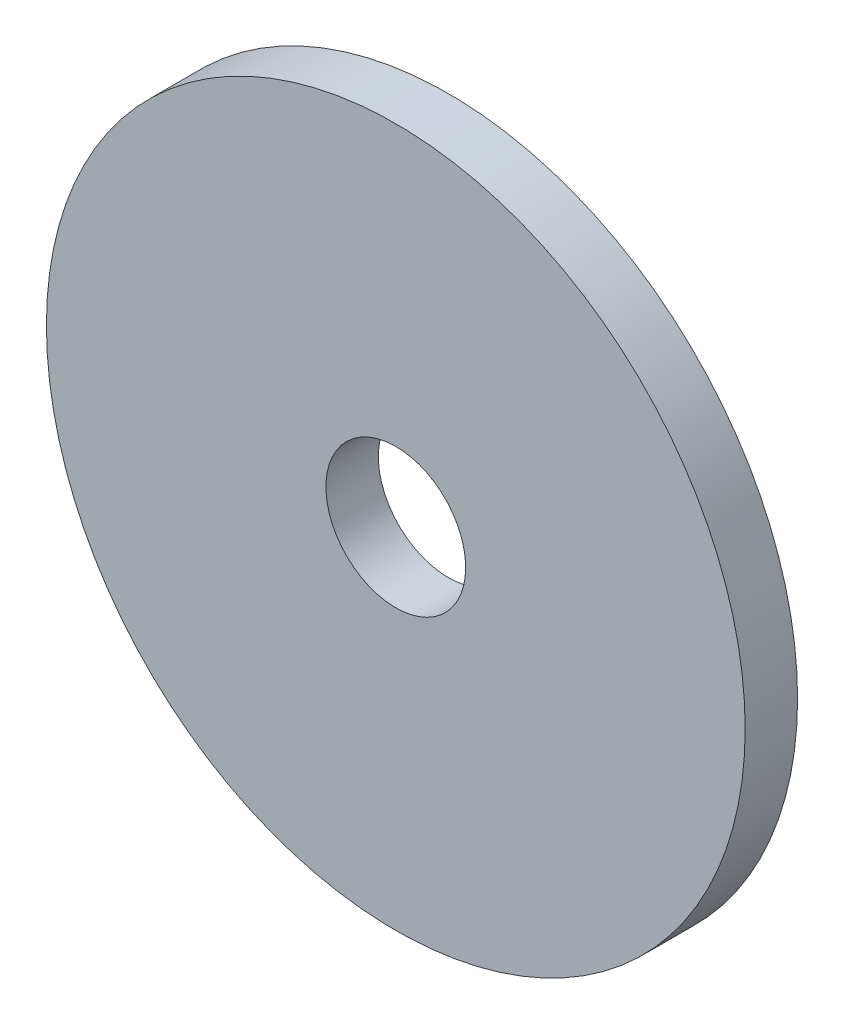
ISO-10303-21;
HEADER;
FILE_DESCRIPTION(('STEP AP214'),'2;1');
FILE_NAME('part.step','',(''),(''),'','','');
FILE_SCHEMA(('AUTOMOTIVE_DESIGN { 1 0 10303 214 1 1 1 1 }'));
ENDSEC;
DATA;
#1=APPLICATION_CONTEXT('core data for automotive mechanical design processes');
#2=APPLICATION_PROTOCOL_DEFINITION('international standard','automotive_design',2000,#1);
#3=PRODUCT_CONTEXT('',#1,'mechanical');
#4=PRODUCT('Part','Part','',(#3));
#5=PRODUCT_RELATED_PRODUCT_CATEGORY('part','',(#4));
#6=PRODUCT_DEFINITION_FORMATION('','',#4);
#7=PRODUCT_DEFINITION_CONTEXT('part definition',#1,'design');
#8=PRODUCT_DEFINITION('design','',#6,#7);
#9=PRODUCT_DEFINITION_SHAPE('','',#8);
#10=(LENGTH_UNIT() NAMED_UNIT(*) SI_UNIT(.MILLI.,.METRE.));
#11=(NAMED_UNIT(*) PLANE_ANGLE_UNIT() SI_UNIT($,.RADIAN.));
#12=(NAMED_UNIT(*) SI_UNIT($,.STERADIAN.) SOLID_ANGLE_UNIT());
#13=UNCERTAINTY_MEASURE_WITH_UNIT(LENGTH_MEASURE(1.E-05),#10,'distance_accuracy_value','');
#14=(GEOMETRIC_REPRESENTATION_CONTEXT(3) GLOBAL_UNCERTAINTY_ASSIGNED_CONTEXT((#13)) GLOBAL_UNIT_ASSIGNED_CONTEXT((#10,
#11,#12)) REPRESENTATION_CONTEXT('',''));
#15=CARTESIAN_POINT('',(0.,0.,0.));
#16=DIRECTION('',(0.,0.,1.));
#17=DIRECTION('',(1.,0.,0.));
#18=AXIS2_PLACEMENT_3D('',#15,#16,#17);
#19=CARTESIAN_POINT('',(-38.1,0.,1.905));
#20=DIRECTION('',(0.,0.,-1.));
#21=DIRECTION('',(-1.,0.,0.));
#22=AXIS2_PLACEMENT_3D('',#19,#20,#21);
#23=CYLINDRICAL_SURFACE('',#22,2.54);
#24=CARTESIAN_POINT('',(-38.1,0.,1.905));
#25=DIRECTION('',(0.,0.,1.));
#26=DIRECTION('',(1.,0.,0.));
#27=AXIS2_PLACEMENT_3D('',#24,#25,#26);
#28=CIRCLE('',#27,2.54);
#29=CARTESIAN_POINT('',(-35.56,0.,1.905));
#30=VERTEX_POINT('',#29);
#31=EDGE_CURVE('E22',#30,#30,#28,.T.);
#32=ORIENTED_EDGE('',*,*,#31,.T.);
#33=EDGE_LOOP('',(#32));
#34=FACE_BOUND('',#33,.T.);
#35=CARTESIAN_POINT('',(-38.1,0.,0.));
#36=DIRECTION('',(0.,0.,1.));
#37=DIRECTION('',(1.,0.,0.));
#38=AXIS2_PLACEMENT_3D('',#35,#36,#37);
#39=CIRCLE('',#38,2.54);
#40=CARTESIAN_POINT('',(-35.56,0.,0.));
#41=VERTEX_POINT('',#40);
#42=EDGE_CURVE('E28',#41,#41,#39,.T.);
#43=ORIENTED_EDGE('',*,*,#42,.F.);
#44=EDGE_LOOP('',(#43));
#45=FACE_BOUND('',#44,.T.);
#46=ADVANCED_FACE('F15',(#34,#45),#23,.F.);
#47=CARTESIAN_POINT('',(-38.1,0.,1.905));
#48=DIRECTION('',(0.,0.,-1.));
#49=DIRECTION('',(-1.,0.,0.));
#50=AXIS2_PLACEMENT_3D('',#47,#48,#49);
#51=CYLINDRICAL_SURFACE('',#50,12.7);
#52=CARTESIAN_POINT('',(-38.1,0.,1.905));
#53=DIRECTION('',(0.,0.,1.));
#54=DIRECTION('',(1.,0.,0.));
#55=AXIS2_PLACEMENT_3D('',#52,#53,#54);
#56=CIRCLE('',#55,12.7);
#57=CARTESIAN_POINT('',(-25.4,0.,1.905));
#58=VERTEX_POINT('',#57);
#59=EDGE_CURVE('E10',#58,#58,#56,.T.);
#60=ORIENTED_EDGE('',*,*,#59,.F.);
#61=EDGE_LOOP('',(#60));
#62=FACE_BOUND('',#61,.T.);
#63=CARTESIAN_POINT('',(-38.1,0.,0.));
#64=DIRECTION('',(0.,0.,1.));
#65=DIRECTION('',(1.,0.,0.));
#66=AXIS2_PLACEMENT_3D('',#63,#64,#65);
#67=CIRCLE('',#66,12.7);
#68=CARTESIAN_POINT('',(-25.4,0.,0.));
#69=VERTEX_POINT('',#68);
#70=EDGE_CURVE('E18',#69,#69,#67,.T.);
#71=ORIENTED_EDGE('',*,*,#70,.T.);
#72=EDGE_LOOP('',(#71));
#73=FACE_BOUND('',#72,.T.);
#74=ADVANCED_FACE('F35',(#62,#73),#51,.T.);
#75=CARTESIAN_POINT('',(-38.1,0.,1.905));
#76=DIRECTION('',(0.,0.,1.));
#77=DIRECTION('',(1.,0.,0.));
#78=AXIS2_PLACEMENT_3D('',#75,#76,#77);
#79=PLANE('',#78);
#80=ORIENTED_EDGE('',*,*,#31,.F.);
#81=EDGE_LOOP('',(#80));
#82=FACE_BOUND('',#81,.T.);
#83=ORIENTED_EDGE('',*,*,#59,.T.);
#84=EDGE_LOOP('',(#83));
#85=FACE_BOUND('',#84,.T.);
#86=ADVANCED_FACE('F39',(#82,#85),#79,.T.);
#87=CARTESIAN_POINT('',(-38.1,0.,0.));
#88=DIRECTION('',(0.,0.,1.));
#89=DIRECTION('',(1.,0.,0.));
#90=AXIS2_PLACEMENT_3D('',#87,#88,#89);
#91=PLANE('',#90);
#92=ORIENTED_EDGE('',*,*,#42,.T.);
#93=EDGE_LOOP('',(#92));
#94=FACE_BOUND('',#93,.T.);
#95=ORIENTED_EDGE('',*,*,#70,.F.);
#96=EDGE_LOOP('',(#95));
#97=FACE_BOUND('',#96,.T.);
#98=ADVANCED_FACE('F37',(#94,#97),#91,.F.);
#99=CLOSED_SHELL('',(#46,#74,#86,#98));
#100=MANIFOLD_SOLID_BREP('B1',#99);
#101=ADVANCED_BREP_SHAPE_REPRESENTATION('',(#18,#100),#14);
#102=SHAPE_DEFINITION_REPRESENTATION(#9,#101);
ENDSEC;
END-ISO-10303-21;
